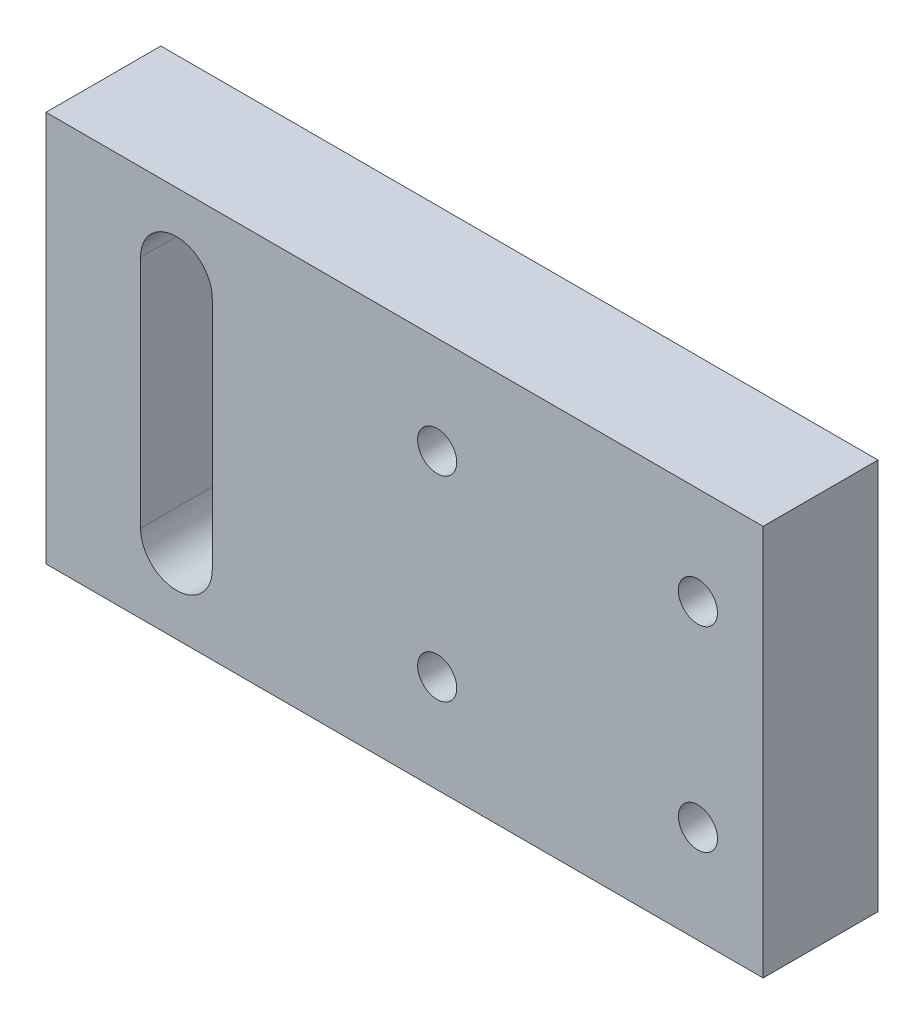
ISO-10303-21;
HEADER;
FILE_DESCRIPTION(('STEP AP214'),'2;1');
FILE_NAME('part.step','',(''),(''),'','','');
FILE_SCHEMA(('AUTOMOTIVE_DESIGN { 1 0 10303 214 1 1 1 1 }'));
ENDSEC;
DATA;
#1=APPLICATION_CONTEXT('core data for automotive mechanical design processes');
#2=APPLICATION_PROTOCOL_DEFINITION('international standard','automotive_design',2000,#1);
#3=PRODUCT_CONTEXT('',#1,'mechanical');
#4=PRODUCT('Part','Part','',(#3));
#5=PRODUCT_RELATED_PRODUCT_CATEGORY('part','',(#4));
#6=PRODUCT_DEFINITION_FORMATION('','',#4);
#7=PRODUCT_DEFINITION_CONTEXT('part definition',#1,'design');
#8=PRODUCT_DEFINITION('design','',#6,#7);
#9=PRODUCT_DEFINITION_SHAPE('','',#8);
#10=(LENGTH_UNIT() NAMED_UNIT(*) SI_UNIT(.MILLI.,.METRE.));
#11=(NAMED_UNIT(*) PLANE_ANGLE_UNIT() SI_UNIT($,.RADIAN.));
#12=(NAMED_UNIT(*) SI_UNIT($,.STERADIAN.) SOLID_ANGLE_UNIT());
#13=UNCERTAINTY_MEASURE_WITH_UNIT(LENGTH_MEASURE(1.E-05),#10,'distance_accuracy_value','');
#14=(GEOMETRIC_REPRESENTATION_CONTEXT(3) GLOBAL_UNCERTAINTY_ASSIGNED_CONTEXT((#13)) GLOBAL_UNIT_ASSIGNED_CONTEXT((#10,
#11,#12)) REPRESENTATION_CONTEXT('',''));
#15=CARTESIAN_POINT('',(0.,0.,0.));
#16=DIRECTION('',(0.,0.,1.));
#17=DIRECTION('',(1.,0.,0.));
#18=AXIS2_PLACEMENT_3D('',#15,#16,#17);
#19=CARTESIAN_POINT('',(0.,0.,0.001899999999978));
#20=DIRECTION('',(0.,0.,1.));
#21=DIRECTION('',(1.,0.,0.));
#22=AXIS2_PLACEMENT_3D('',#19,#20,#21);
#23=PLANE('',#22);
#24=CARTESIAN_POINT('',(50.,22.5,0.001899999999978));
#25=DIRECTION('',(0.,0.,1.));
#26=DIRECTION('',(1.,0.,0.));
#27=AXIS2_PLACEMENT_3D('',#24,#25,#26);
#28=CIRCLE('',#27,1.5);
#29=CARTESIAN_POINT('',(51.5,22.5,0.001899999999978));
#30=VERTEX_POINT('',#29);
#31=EDGE_CURVE('E129',#30,#30,#28,.T.);
#32=ORIENTED_EDGE('',*,*,#31,.T.);
#33=EDGE_LOOP('',(#32));
#34=FACE_BOUND('',#33,.T.);
#35=CARTESIAN_POINT('',(30.,22.5,0.001899999999978));
#36=DIRECTION('',(0.,0.,1.));
#37=DIRECTION('',(1.,0.,0.));
#38=AXIS2_PLACEMENT_3D('',#35,#36,#37);
#39=CIRCLE('',#38,1.5);
#40=CARTESIAN_POINT('',(31.5,22.5,0.001899999999978));
#41=VERTEX_POINT('',#40);
#42=EDGE_CURVE('E106',#41,#41,#39,.T.);
#43=ORIENTED_EDGE('',*,*,#42,.T.);
#44=EDGE_LOOP('',(#43));
#45=FACE_BOUND('',#44,.T.);
#46=CARTESIAN_POINT('',(10.,24.,0.001899999999978));
#47=DIRECTION('',(0.,0.,-1.));
#48=DIRECTION('',(-1.,0.,0.));
#49=AXIS2_PLACEMENT_3D('',#46,#47,#48);
#50=CIRCLE('',#49,2.75);
#51=CARTESIAN_POINT('',(12.75,24.,0.001899999999978));
#52=VERTEX_POINT('',#51);
#53=CARTESIAN_POINT('',(7.25,24.,0.001899999999978));
#54=VERTEX_POINT('',#53);
#55=EDGE_CURVE('E135',#52,#54,#50,.F.);
#56=ORIENTED_EDGE('',*,*,#55,.T.);
#57=DIRECTION('',(0.,-1.,0.));
#58=VECTOR('',#57,1.);
#59=CARTESIAN_POINT('',(7.25,6.,0.001899999999978));
#60=LINE('',#59,#58);
#61=CARTESIAN_POINT('',(7.25,6.,0.001899999999978));
#62=VERTEX_POINT('',#61);
#63=EDGE_CURVE('E108',#54,#62,#60,.T.);
#64=ORIENTED_EDGE('',*,*,#63,.T.);
#65=CARTESIAN_POINT('',(10.,6.,0.001899999999978));
#66=DIRECTION('',(0.,0.,-1.));
#67=DIRECTION('',(-1.,0.,0.));
#68=AXIS2_PLACEMENT_3D('',#65,#66,#67);
#69=CIRCLE('',#68,2.75);
#70=CARTESIAN_POINT('',(12.75,6.,0.001899999999978));
#71=VERTEX_POINT('',#70);
#72=EDGE_CURVE('E57',#62,#71,#69,.F.);
#73=ORIENTED_EDGE('',*,*,#72,.T.);
#74=DIRECTION('',(0.,1.,0.));
#75=VECTOR('',#74,1.);
#76=CARTESIAN_POINT('',(12.75,24.,0.001899999999978));
#77=LINE('',#76,#75);
#78=EDGE_CURVE('E103',#71,#52,#77,.T.);
#79=ORIENTED_EDGE('',*,*,#78,.T.);
#80=EDGE_LOOP('',(#56,#64,#73,#79));
#81=FACE_BOUND('',#80,.T.);
#82=CARTESIAN_POINT('',(50.,7.5,0.001899999999978));
#83=DIRECTION('',(0.,0.,1.));
#84=DIRECTION('',(1.,0.,0.));
#85=AXIS2_PLACEMENT_3D('',#82,#83,#84);
#86=CIRCLE('',#85,1.5);
#87=CARTESIAN_POINT('',(51.5,7.5,0.001899999999978));
#88=VERTEX_POINT('',#87);
#89=EDGE_CURVE('E138',#88,#88,#86,.T.);
#90=ORIENTED_EDGE('',*,*,#89,.T.);
#91=EDGE_LOOP('',(#90));
#92=FACE_BOUND('',#91,.T.);
#93=CARTESIAN_POINT('',(30.,7.5,0.001899999999978));
#94=DIRECTION('',(0.,0.,1.));
#95=DIRECTION('',(1.,0.,0.));
#96=AXIS2_PLACEMENT_3D('',#93,#94,#95);
#97=CIRCLE('',#96,1.5);
#98=CARTESIAN_POINT('',(31.5,7.5,0.001899999999978));
#99=VERTEX_POINT('',#98);
#100=EDGE_CURVE('E19',#99,#99,#97,.T.);
#101=ORIENTED_EDGE('',*,*,#100,.T.);
#102=EDGE_LOOP('',(#101));
#103=FACE_BOUND('',#102,.T.);
#104=DIRECTION('',(0.,1.,0.));
#105=VECTOR('',#104,1.);
#106=CARTESIAN_POINT('',(55.,0.,0.001899999999978));
#107=LINE('',#106,#105);
#108=CARTESIAN_POINT('',(55.,0.,0.001899999999978));
#109=VERTEX_POINT('',#108);
#110=CARTESIAN_POINT('',(55.,30.,0.001899999999978));
#111=VERTEX_POINT('',#110);
#112=EDGE_CURVE('E77',#109,#111,#107,.T.);
#113=ORIENTED_EDGE('',*,*,#112,.F.);
#114=DIRECTION('',(1.,0.,0.));
#115=VECTOR('',#114,1.);
#116=CARTESIAN_POINT('',(0.,0.,0.001899999999978));
#117=LINE('',#116,#115);
#118=CARTESIAN_POINT('',(0.,0.,0.001899999999978));
#119=VERTEX_POINT('',#118);
#120=EDGE_CURVE('E75',#109,#119,#117,.F.);
#121=ORIENTED_EDGE('',*,*,#120,.T.);
#122=DIRECTION('',(0.,1.,0.));
#123=VECTOR('',#122,1.);
#124=CARTESIAN_POINT('',(0.,0.,0.001899999999978));
#125=LINE('',#124,#123);
#126=CARTESIAN_POINT('',(0.,30.,0.001899999999978));
#127=VERTEX_POINT('',#126);
#128=EDGE_CURVE('E66',#119,#127,#125,.T.);
#129=ORIENTED_EDGE('',*,*,#128,.T.);
#130=DIRECTION('',(1.,0.,0.));
#131=VECTOR('',#130,1.);
#132=CARTESIAN_POINT('',(0.,30.,0.001899999999978));
#133=LINE('',#132,#131);
#134=EDGE_CURVE('E151',#111,#127,#133,.F.);
#135=ORIENTED_EDGE('',*,*,#134,.F.);
#136=EDGE_LOOP('',(#113,#121,#129,#135));
#137=FACE_BOUND('',#136,.T.);
#138=ADVANCED_FACE('F16',(#34,#45,#81,#92,#103,#137),#23,.F.);
#139=CARTESIAN_POINT('',(0.,0.,0.001899999999978));
#140=DIRECTION('',(1.,0.,0.));
#141=DIRECTION('',(0.,0.,-1.));
#142=AXIS2_PLACEMENT_3D('',#139,#140,#141);
#143=PLANE('',#142);
#144=DIRECTION('',(0.,0.,1.));
#145=VECTOR('',#144,1.);
#146=CARTESIAN_POINT('',(0.,30.,0.001899999999978));
#147=LINE('',#146,#145);
#148=CARTESIAN_POINT('',(0.,30.,8.809633853925));
#149=VERTEX_POINT('',#148);
#150=EDGE_CURVE('E91',#127,#149,#147,.T.);
#151=ORIENTED_EDGE('',*,*,#150,.F.);
#152=ORIENTED_EDGE('',*,*,#128,.F.);
#153=DIRECTION('',(0.,0.,1.));
#154=VECTOR('',#153,1.);
#155=CARTESIAN_POINT('',(0.,0.,0.001899999999978));
#156=LINE('',#155,#154);
#157=CARTESIAN_POINT('',(0.,0.,8.809633853925));
#158=VERTEX_POINT('',#157);
#159=EDGE_CURVE('E82',#119,#158,#156,.T.);
#160=ORIENTED_EDGE('',*,*,#159,.T.);
#161=DIRECTION('',(0.,1.,0.));
#162=VECTOR('',#161,1.);
#163=CARTESIAN_POINT('',(0.,0.,8.809633853925));
#164=LINE('',#163,#162);
#165=EDGE_CURVE('E132',#149,#158,#164,.F.);
#166=ORIENTED_EDGE('',*,*,#165,.F.);
#167=EDGE_LOOP('',(#151,#152,#160,#166));
#168=FACE_BOUND('',#167,.T.);
#169=ADVANCED_FACE('F86',(#168),#143,.F.);
#170=CARTESIAN_POINT('',(0.,0.,0.001899999999978));
#171=DIRECTION('',(0.,1.,0.));
#172=DIRECTION('',(0.,0.,1.));
#173=AXIS2_PLACEMENT_3D('',#170,#171,#172);
#174=PLANE('',#173);
#175=DIRECTION('',(1.,0.,0.));
#176=VECTOR('',#175,1.);
#177=CARTESIAN_POINT('',(0.,0.,8.809633853925));
#178=LINE('',#177,#176);
#179=CARTESIAN_POINT('',(55.,0.,8.809633853925));
#180=VERTEX_POINT('',#179);
#181=EDGE_CURVE('E96',#158,#180,#178,.T.);
#182=ORIENTED_EDGE('',*,*,#181,.F.);
#183=ORIENTED_EDGE('',*,*,#159,.F.);
#184=ORIENTED_EDGE('',*,*,#120,.F.);
#185=DIRECTION('',(0.,0.,-1.));
#186=VECTOR('',#185,1.);
#187=CARTESIAN_POINT('',(55.,0.,0.001899999999978));
#188=LINE('',#187,#186);
#189=EDGE_CURVE('E98',#180,#109,#188,.T.);
#190=ORIENTED_EDGE('',*,*,#189,.F.);
#191=EDGE_LOOP('',(#182,#183,#184,#190));
#192=FACE_BOUND('',#191,.T.);
#193=ADVANCED_FACE('F94',(#192),#174,.F.);
#194=CARTESIAN_POINT('',(55.,0.,0.001899999999978));
#195=DIRECTION('',(1.,0.,0.));
#196=DIRECTION('',(0.,0.,-1.));
#197=AXIS2_PLACEMENT_3D('',#194,#195,#196);
#198=PLANE('',#197);
#199=DIRECTION('',(0.,0.,1.));
#200=VECTOR('',#199,1.);
#201=CARTESIAN_POINT('',(55.,30.,0.001899999999978));
#202=LINE('',#201,#200);
#203=CARTESIAN_POINT('',(55.,30.,8.809633853925));
#204=VERTEX_POINT('',#203);
#205=EDGE_CURVE('E143',#204,#111,#202,.F.);
#206=ORIENTED_EDGE('',*,*,#205,.F.);
#207=DIRECTION('',(0.,1.,0.));
#208=VECTOR('',#207,1.);
#209=CARTESIAN_POINT('',(55.,0.,8.809633853925));
#210=LINE('',#209,#208);
#211=EDGE_CURVE('E161',#180,#204,#210,.T.);
#212=ORIENTED_EDGE('',*,*,#211,.F.);
#213=ORIENTED_EDGE('',*,*,#189,.T.);
#214=ORIENTED_EDGE('',*,*,#112,.T.);
#215=EDGE_LOOP('',(#206,#212,#213,#214));
#216=FACE_BOUND('',#215,.T.);
#217=ADVANCED_FACE('F157',(#216),#198,.T.);
#218=CARTESIAN_POINT('',(0.,30.,0.001899999999978));
#219=DIRECTION('',(0.,1.,0.));
#220=DIRECTION('',(0.,0.,1.));
#221=AXIS2_PLACEMENT_3D('',#218,#219,#220);
#222=PLANE('',#221);
#223=DIRECTION('',(1.,0.,0.));
#224=VECTOR('',#223,1.);
#225=CARTESIAN_POINT('',(0.,30.,8.809633853925));
#226=LINE('',#225,#224);
#227=EDGE_CURVE('E128',#204,#149,#226,.F.);
#228=ORIENTED_EDGE('',*,*,#227,.F.);
#229=ORIENTED_EDGE('',*,*,#205,.T.);
#230=ORIENTED_EDGE('',*,*,#134,.T.);
#231=ORIENTED_EDGE('',*,*,#150,.T.);
#232=EDGE_LOOP('',(#228,#229,#230,#231));
#233=FACE_BOUND('',#232,.T.);
#234=ADVANCED_FACE('F193',(#233),#222,.T.);
#235=CARTESIAN_POINT('',(30.,7.5,0.001899999999978));
#236=DIRECTION('',(0.,0.,1.));
#237=DIRECTION('',(1.,0.,0.));
#238=AXIS2_PLACEMENT_3D('',#235,#236,#237);
#239=CYLINDRICAL_SURFACE('',#238,1.5);
#240=ORIENTED_EDGE('',*,*,#100,.F.);
#241=EDGE_LOOP('',(#240));
#242=FACE_BOUND('',#241,.T.);
#243=CARTESIAN_POINT('',(30.,7.5,8.809633853925));
#244=DIRECTION('',(0.,0.,1.));
#245=DIRECTION('',(1.,0.,0.));
#246=AXIS2_PLACEMENT_3D('',#243,#244,#245);
#247=CIRCLE('',#246,1.5);
#248=CARTESIAN_POINT('',(31.5,7.5,8.809633853925));
#249=VERTEX_POINT('',#248);
#250=EDGE_CURVE('E125',#249,#249,#247,.F.);
#251=ORIENTED_EDGE('',*,*,#250,.F.);
#252=EDGE_LOOP('',(#251));
#253=FACE_BOUND('',#252,.T.);
#254=ADVANCED_FACE('F195',(#242,#253),#239,.F.);
#255=CARTESIAN_POINT('',(50.,7.5,0.001899999999978));
#256=DIRECTION('',(0.,0.,1.));
#257=DIRECTION('',(1.,0.,0.));
#258=AXIS2_PLACEMENT_3D('',#255,#256,#257);
#259=CYLINDRICAL_SURFACE('',#258,1.5);
#260=ORIENTED_EDGE('',*,*,#89,.F.);
#261=EDGE_LOOP('',(#260));
#262=FACE_BOUND('',#261,.T.);
#263=CARTESIAN_POINT('',(50.,7.5,8.809633853925));
#264=DIRECTION('',(0.,0.,1.));
#265=DIRECTION('',(1.,0.,0.));
#266=AXIS2_PLACEMENT_3D('',#263,#264,#265);
#267=CIRCLE('',#266,1.5);
#268=CARTESIAN_POINT('',(51.5,7.5,8.809633853925));
#269=VERTEX_POINT('',#268);
#270=EDGE_CURVE('E122',#269,#269,#267,.F.);
#271=ORIENTED_EDGE('',*,*,#270,.F.);
#272=EDGE_LOOP('',(#271));
#273=FACE_BOUND('',#272,.T.);
#274=ADVANCED_FACE('F202',(#262,#273),#259,.F.);
#275=CARTESIAN_POINT('',(10.,6.,0.001899999999978));
#276=DIRECTION('',(0.,0.,-1.));
#277=DIRECTION('',(-1.,0.,0.));
#278=AXIS2_PLACEMENT_3D('',#275,#276,#277);
#279=CYLINDRICAL_SURFACE('',#278,2.75);
#280=DIRECTION('',(0.,0.,1.));
#281=VECTOR('',#280,1.);
#282=CARTESIAN_POINT('',(7.25,6.,0.001899999999978));
#283=LINE('',#282,#281);
#284=CARTESIAN_POINT('',(7.25,6.,8.809633853925));
#285=VERTEX_POINT('',#284);
#286=EDGE_CURVE('E110',#62,#285,#283,.T.);
#287=ORIENTED_EDGE('',*,*,#286,.T.);
#288=CARTESIAN_POINT('',(10.,6.,8.809633853925));
#289=DIRECTION('',(0.,0.,-1.));
#290=DIRECTION('',(-1.,0.,0.));
#291=AXIS2_PLACEMENT_3D('',#288,#289,#290);
#292=CIRCLE('',#291,2.75);
#293=CARTESIAN_POINT('',(12.75,6.,8.809633853925));
#294=VERTEX_POINT('',#293);
#295=EDGE_CURVE('E119',#294,#285,#292,.T.);
#296=ORIENTED_EDGE('',*,*,#295,.F.);
#297=DIRECTION('',(0.,0.,1.));
#298=VECTOR('',#297,1.);
#299=CARTESIAN_POINT('',(12.75,6.,0.001899999999978));
#300=LINE('',#299,#298);
#301=EDGE_CURVE('E107',#294,#71,#300,.F.);
#302=ORIENTED_EDGE('',*,*,#301,.T.);
#303=ORIENTED_EDGE('',*,*,#72,.F.);
#304=EDGE_LOOP('',(#287,#296,#302,#303));
#305=FACE_BOUND('',#304,.T.);
#306=ADVANCED_FACE('F170',(#305),#279,.F.);
#307=CARTESIAN_POINT('',(7.25,6.,0.001899999999978));
#308=DIRECTION('',(-1.,0.,0.));
#309=DIRECTION('',(0.,-1.,0.));
#310=AXIS2_PLACEMENT_3D('',#307,#308,#309);
#311=PLANE('',#310);
#312=DIRECTION('',(0.,0.,-1.));
#313=VECTOR('',#312,1.);
#314=CARTESIAN_POINT('',(7.25,24.,0.001899999999978));
#315=LINE('',#314,#313);
#316=CARTESIAN_POINT('',(7.25,24.,8.809633853925));
#317=VERTEX_POINT('',#316);
#318=EDGE_CURVE('E109',#54,#317,#315,.F.);
#319=ORIENTED_EDGE('',*,*,#318,.T.);
#320=DIRECTION('',(0.,1.,0.));
#321=VECTOR('',#320,1.);
#322=CARTESIAN_POINT('',(7.25,0.,8.809633853925));
#323=LINE('',#322,#321);
#324=EDGE_CURVE('E118',#285,#317,#323,.T.);
#325=ORIENTED_EDGE('',*,*,#324,.F.);
#326=ORIENTED_EDGE('',*,*,#286,.F.);
#327=ORIENTED_EDGE('',*,*,#63,.F.);
#328=EDGE_LOOP('',(#319,#325,#326,#327));
#329=FACE_BOUND('',#328,.T.);
#330=ADVANCED_FACE('F181',(#329),#311,.F.);
#331=CARTESIAN_POINT('',(10.,24.,0.001899999999978));
#332=DIRECTION('',(0.,0.,-1.));
#333=DIRECTION('',(-1.,0.,0.));
#334=AXIS2_PLACEMENT_3D('',#331,#332,#333);
#335=CYLINDRICAL_SURFACE('',#334,2.75);
#336=DIRECTION('',(0.,0.,1.));
#337=VECTOR('',#336,1.);
#338=CARTESIAN_POINT('',(12.75,24.,0.001899999999978));
#339=LINE('',#338,#337);
#340=CARTESIAN_POINT('',(12.75,24.,8.809633853925));
#341=VERTEX_POINT('',#340);
#342=EDGE_CURVE('E34',#52,#341,#339,.T.);
#343=ORIENTED_EDGE('',*,*,#342,.T.);
#344=CARTESIAN_POINT('',(10.,24.,8.809633853925));
#345=DIRECTION('',(0.,0.,-1.));
#346=DIRECTION('',(-1.,0.,0.));
#347=AXIS2_PLACEMENT_3D('',#344,#345,#346);
#348=CIRCLE('',#347,2.75);
#349=EDGE_CURVE('E115',#317,#341,#348,.T.);
#350=ORIENTED_EDGE('',*,*,#349,.F.);
#351=ORIENTED_EDGE('',*,*,#318,.F.);
#352=ORIENTED_EDGE('',*,*,#55,.F.);
#353=EDGE_LOOP('',(#343,#350,#351,#352));
#354=FACE_BOUND('',#353,.T.);
#355=ADVANCED_FACE('F183',(#354),#335,.F.);
#356=CARTESIAN_POINT('',(12.75,24.,0.001899999999978));
#357=DIRECTION('',(1.,0.,0.));
#358=DIRECTION('',(0.,1.,0.));
#359=AXIS2_PLACEMENT_3D('',#356,#357,#358);
#360=PLANE('',#359);
#361=ORIENTED_EDGE('',*,*,#301,.F.);
#362=DIRECTION('',(0.,1.,0.));
#363=VECTOR('',#362,1.);
#364=CARTESIAN_POINT('',(12.75,0.,8.809633853925));
#365=LINE('',#364,#363);
#366=EDGE_CURVE('E114',#341,#294,#365,.F.);
#367=ORIENTED_EDGE('',*,*,#366,.F.);
#368=ORIENTED_EDGE('',*,*,#342,.F.);
#369=ORIENTED_EDGE('',*,*,#78,.F.);
#370=EDGE_LOOP('',(#361,#367,#368,#369));
#371=FACE_BOUND('',#370,.T.);
#372=ADVANCED_FACE('F174',(#371),#360,.F.);
#373=CARTESIAN_POINT('',(30.,22.5,0.001899999999978));
#374=DIRECTION('',(0.,0.,1.));
#375=DIRECTION('',(1.,0.,0.));
#376=AXIS2_PLACEMENT_3D('',#373,#374,#375);
#377=CYLINDRICAL_SURFACE('',#376,1.5);
#378=ORIENTED_EDGE('',*,*,#42,.F.);
#379=EDGE_LOOP('',(#378));
#380=FACE_BOUND('',#379,.T.);
#381=CARTESIAN_POINT('',(30.,22.5,8.809633853925));
#382=DIRECTION('',(0.,0.,1.));
#383=DIRECTION('',(1.,0.,0.));
#384=AXIS2_PLACEMENT_3D('',#381,#382,#383);
#385=CIRCLE('',#384,1.5);
#386=CARTESIAN_POINT('',(31.5,22.5,8.809633853925));
#387=VERTEX_POINT('',#386);
#388=EDGE_CURVE('E25',#387,#387,#385,.F.);
#389=ORIENTED_EDGE('',*,*,#388,.F.);
#390=EDGE_LOOP('',(#389));
#391=FACE_BOUND('',#390,.T.);
#392=ADVANCED_FACE('F213',(#380,#391),#377,.F.);
#393=CARTESIAN_POINT('',(50.,22.5,0.001899999999978));
#394=DIRECTION('',(0.,0.,1.));
#395=DIRECTION('',(1.,0.,0.));
#396=AXIS2_PLACEMENT_3D('',#393,#394,#395);
#397=CYLINDRICAL_SURFACE('',#396,1.5);
#398=ORIENTED_EDGE('',*,*,#31,.F.);
#399=EDGE_LOOP('',(#398));
#400=FACE_BOUND('',#399,.T.);
#401=CARTESIAN_POINT('',(50.,22.5,8.809633853925));
#402=DIRECTION('',(0.,0.,1.));
#403=DIRECTION('',(1.,0.,0.));
#404=AXIS2_PLACEMENT_3D('',#401,#402,#403);
#405=CIRCLE('',#404,1.5);
#406=CARTESIAN_POINT('',(51.5,22.5,8.809633853925));
#407=VERTEX_POINT('',#406);
#408=EDGE_CURVE('E11',#407,#407,#405,.F.);
#409=ORIENTED_EDGE('',*,*,#408,.F.);
#410=EDGE_LOOP('',(#409));
#411=FACE_BOUND('',#410,.T.);
#412=ADVANCED_FACE('F207',(#400,#411),#397,.F.);
#413=CARTESIAN_POINT('',(0.,0.,8.809633853925));
#414=DIRECTION('',(0.,0.,1.));
#415=DIRECTION('',(1.,0.,0.));
#416=AXIS2_PLACEMENT_3D('',#413,#414,#415);
#417=PLANE('',#416);
#418=ORIENTED_EDGE('',*,*,#408,.T.);
#419=EDGE_LOOP('',(#418));
#420=FACE_BOUND('',#419,.T.);
#421=ORIENTED_EDGE('',*,*,#388,.T.);
#422=EDGE_LOOP('',(#421));
#423=FACE_BOUND('',#422,.T.);
#424=ORIENTED_EDGE('',*,*,#349,.T.);
#425=ORIENTED_EDGE('',*,*,#366,.T.);
#426=ORIENTED_EDGE('',*,*,#295,.T.);
#427=ORIENTED_EDGE('',*,*,#324,.T.);
#428=EDGE_LOOP('',(#424,#425,#426,#427));
#429=FACE_BOUND('',#428,.T.);
#430=ORIENTED_EDGE('',*,*,#270,.T.);
#431=EDGE_LOOP('',(#430));
#432=FACE_BOUND('',#431,.T.);
#433=ORIENTED_EDGE('',*,*,#250,.T.);
#434=EDGE_LOOP('',(#433));
#435=FACE_BOUND('',#434,.T.);
#436=ORIENTED_EDGE('',*,*,#211,.T.);
#437=ORIENTED_EDGE('',*,*,#227,.T.);
#438=ORIENTED_EDGE('',*,*,#165,.T.);
#439=ORIENTED_EDGE('',*,*,#181,.T.);
#440=EDGE_LOOP('',(#436,#437,#438,#439));
#441=FACE_BOUND('',#440,.T.);
#442=ADVANCED_FACE('F185',(#420,#423,#429,#432,#435,#441),#417,.T.);
#443=CLOSED_SHELL('',(#138,#169,#193,#217,#234,#254,#274,#306,#330,#355,#372,#392,#412,#442));
#444=MANIFOLD_SOLID_BREP('B1',#443);
#445=ADVANCED_BREP_SHAPE_REPRESENTATION('',(#18,#444),#14);
#446=SHAPE_DEFINITION_REPRESENTATION(#9,#445);
ENDSEC;
END-ISO-10303-21;
